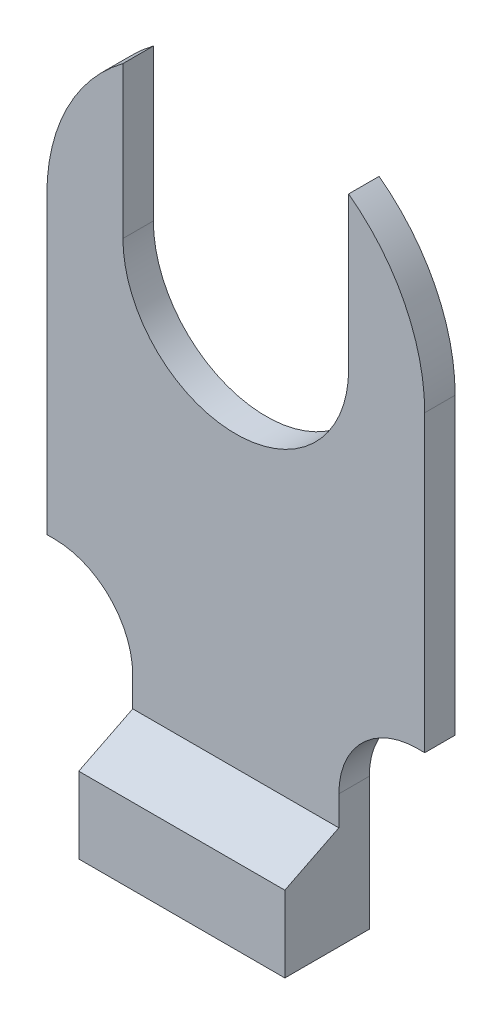
ISO-10303-21;
HEADER;
FILE_DESCRIPTION(('STEP AP214'),'2;1');
FILE_NAME('part.step','',(''),(''),'','','');
FILE_SCHEMA(('AUTOMOTIVE_DESIGN { 1 0 10303 214 1 1 1 1 }'));
ENDSEC;
DATA;
#1=APPLICATION_CONTEXT('core data for automotive mechanical design processes');
#2=APPLICATION_PROTOCOL_DEFINITION('international standard','automotive_design',2000,#1);
#3=PRODUCT_CONTEXT('',#1,'mechanical');
#4=PRODUCT('Part','Part','',(#3));
#5=PRODUCT_RELATED_PRODUCT_CATEGORY('part','',(#4));
#6=PRODUCT_DEFINITION_FORMATION('','',#4);
#7=PRODUCT_DEFINITION_CONTEXT('part definition',#1,'design');
#8=PRODUCT_DEFINITION('design','',#6,#7);
#9=PRODUCT_DEFINITION_SHAPE('','',#8);
#10=(LENGTH_UNIT() NAMED_UNIT(*) SI_UNIT(.MILLI.,.METRE.));
#11=(NAMED_UNIT(*) PLANE_ANGLE_UNIT() SI_UNIT($,.RADIAN.));
#12=(NAMED_UNIT(*) SI_UNIT($,.STERADIAN.) SOLID_ANGLE_UNIT());
#13=UNCERTAINTY_MEASURE_WITH_UNIT(LENGTH_MEASURE(1.E-05),#10,'distance_accuracy_value','');
#14=(GEOMETRIC_REPRESENTATION_CONTEXT(3) GLOBAL_UNCERTAINTY_ASSIGNED_CONTEXT((#13)) GLOBAL_UNIT_ASSIGNED_CONTEXT((#10,
#11,#12)) REPRESENTATION_CONTEXT('',''));
#15=CARTESIAN_POINT('',(0.,0.,0.));
#16=DIRECTION('',(0.,0.,1.));
#17=DIRECTION('',(1.,0.,0.));
#18=AXIS2_PLACEMENT_3D('',#15,#16,#17);
#19=CARTESIAN_POINT('',(0.,0.,1.24));
#20=DIRECTION('',(0.,0.,-1.));
#21=DIRECTION('',(-1.,0.,0.));
#22=AXIS2_PLACEMENT_3D('',#19,#20,#21);
#23=CYLINDRICAL_SURFACE('',#22,4.6);
#24=CARTESIAN_POINT('',(0.,0.,0.));
#25=DIRECTION('',(0.,0.,-1.));
#26=DIRECTION('',(1.,0.,0.));
#27=AXIS2_PLACEMENT_3D('',#24,#25,#26);
#28=CIRCLE('',#27,4.6);
#29=CARTESIAN_POINT('',(4.6,0.,0.));
#30=VERTEX_POINT('',#29);
#31=CARTESIAN_POINT('',(-4.6,0.,0.));
#32=VERTEX_POINT('',#31);
#33=EDGE_CURVE('E198',#30,#32,#28,.T.);
#34=ORIENTED_EDGE('',*,*,#33,.T.);
#35=DIRECTION('',(0.,0.,-1.));
#36=VECTOR('',#35,1.);
#37=CARTESIAN_POINT('',(-4.6,0.,1.24));
#38=LINE('',#37,#36);
#39=CARTESIAN_POINT('',(-4.6,0.,1.24));
#40=VERTEX_POINT('',#39);
#41=EDGE_CURVE('E258',#40,#32,#38,.T.);
#42=ORIENTED_EDGE('',*,*,#41,.F.);
#43=CARTESIAN_POINT('',(0.,0.,1.24));
#44=DIRECTION('',(0.,0.,-1.));
#45=DIRECTION('',(1.,0.,0.));
#46=AXIS2_PLACEMENT_3D('',#43,#44,#45);
#47=CIRCLE('',#46,4.6);
#48=CARTESIAN_POINT('',(4.6,0.,1.24));
#49=VERTEX_POINT('',#48);
#50=EDGE_CURVE('E210',#49,#40,#47,.T.);
#51=ORIENTED_EDGE('',*,*,#50,.F.);
#52=DIRECTION('',(0.,0.,-1.));
#53=VECTOR('',#52,1.);
#54=CARTESIAN_POINT('',(4.6,0.,1.24));
#55=LINE('',#54,#53);
#56=EDGE_CURVE('E227',#49,#30,#55,.T.);
#57=ORIENTED_EDGE('',*,*,#56,.T.);
#58=EDGE_LOOP('',(#34,#42,#51,#57));
#59=FACE_BOUND('',#58,.T.);
#60=ADVANCED_FACE('F35',(#59),#23,.F.);
#61=CARTESIAN_POINT('',(-4.6,0.,1.24));
#62=DIRECTION('',(-1.,0.,0.));
#63=DIRECTION('',(0.,0.,1.));
#64=AXIS2_PLACEMENT_3D('',#61,#62,#63);
#65=PLANE('',#64);
#66=DIRECTION('',(0.,1.,0.));
#67=VECTOR('',#66,1.);
#68=CARTESIAN_POINT('',(-4.6,0.,0.));
#69=LINE('',#68,#67);
#70=CARTESIAN_POINT('',(-4.6,6.17494939250517,0.));
#71=VERTEX_POINT('',#70);
#72=EDGE_CURVE('E230',#32,#71,#69,.T.);
#73=ORIENTED_EDGE('',*,*,#72,.T.);
#74=DIRECTION('',(0.,0.,-1.));
#75=VECTOR('',#74,1.);
#76=CARTESIAN_POINT('',(-4.6,6.17494939250517,1.24));
#77=LINE('',#76,#75);
#78=CARTESIAN_POINT('',(-4.6,6.17494939250517,1.24));
#79=VERTEX_POINT('',#78);
#80=EDGE_CURVE('E255',#79,#71,#77,.T.);
#81=ORIENTED_EDGE('',*,*,#80,.F.);
#82=DIRECTION('',(0.,1.,0.));
#83=VECTOR('',#82,1.);
#84=CARTESIAN_POINT('',(-4.6,0.,1.24));
#85=LINE('',#84,#83);
#86=EDGE_CURVE('E213',#40,#79,#85,.T.);
#87=ORIENTED_EDGE('',*,*,#86,.F.);
#88=ORIENTED_EDGE('',*,*,#41,.T.);
#89=EDGE_LOOP('',(#73,#81,#87,#88));
#90=FACE_BOUND('',#89,.T.);
#91=ADVANCED_FACE('F308',(#90),#65,.F.);
#92=CARTESIAN_POINT('',(0.,0.,1.24));
#93=DIRECTION('',(0.,0.,-1.));
#94=DIRECTION('',(-1.,0.,0.));
#95=AXIS2_PLACEMENT_3D('',#92,#93,#94);
#96=CYLINDRICAL_SURFACE('',#95,7.7);
#97=CARTESIAN_POINT('',(0.,0.,0.));
#98=DIRECTION('',(0.,0.,1.));
#99=DIRECTION('',(1.,0.,0.));
#100=AXIS2_PLACEMENT_3D('',#97,#98,#99);
#101=CIRCLE('',#100,7.7);
#102=CARTESIAN_POINT('',(-7.7,0.,0.));
#103=VERTEX_POINT('',#102);
#104=EDGE_CURVE('E232',#71,#103,#101,.T.);
#105=ORIENTED_EDGE('',*,*,#104,.T.);
#106=DIRECTION('',(0.,0.,-1.));
#107=VECTOR('',#106,1.);
#108=CARTESIAN_POINT('',(-7.7,0.,1.24));
#109=LINE('',#108,#107);
#110=CARTESIAN_POINT('',(-7.7,0.,1.24));
#111=VERTEX_POINT('',#110);
#112=EDGE_CURVE('E252',#111,#103,#109,.T.);
#113=ORIENTED_EDGE('',*,*,#112,.F.);
#114=CARTESIAN_POINT('',(0.,0.,1.24));
#115=DIRECTION('',(0.,0.,1.));
#116=DIRECTION('',(1.,0.,0.));
#117=AXIS2_PLACEMENT_3D('',#114,#115,#116);
#118=CIRCLE('',#117,7.7);
#119=EDGE_CURVE('E216',#79,#111,#118,.T.);
#120=ORIENTED_EDGE('',*,*,#119,.F.);
#121=ORIENTED_EDGE('',*,*,#80,.T.);
#122=EDGE_LOOP('',(#105,#113,#120,#121));
#123=FACE_BOUND('',#122,.T.);
#124=ADVANCED_FACE('F313',(#123),#96,.T.);
#125=CARTESIAN_POINT('',(-7.7,-20.6,1.24));
#126=DIRECTION('',(1.,0.,0.));
#127=DIRECTION('',(0.,1.,0.));
#128=AXIS2_PLACEMENT_3D('',#125,#126,#127);
#129=PLANE('',#128);
#130=DIRECTION('',(0.,-1.,0.));
#131=VECTOR('',#130,1.);
#132=CARTESIAN_POINT('',(-7.7,-20.6,0.));
#133=LINE('',#132,#131);
#134=CARTESIAN_POINT('',(-7.7,-12.,0.));
#135=VERTEX_POINT('',#134);
#136=EDGE_CURVE('E234',#103,#135,#133,.T.);
#137=ORIENTED_EDGE('',*,*,#136,.T.);
#138=DIRECTION('',(0.,0.,1.));
#139=VECTOR('',#138,1.);
#140=CARTESIAN_POINT('',(-7.7,-12.,-9.28493403315286));
#141=LINE('',#140,#139);
#142=CARTESIAN_POINT('',(-7.7,-12.,1.24));
#143=VERTEX_POINT('',#142);
#144=EDGE_CURVE('E193',#135,#143,#141,.T.);
#145=ORIENTED_EDGE('',*,*,#144,.T.);
#146=DIRECTION('',(0.,-1.,0.));
#147=VECTOR('',#146,1.);
#148=CARTESIAN_POINT('',(-7.7,-20.6,1.24));
#149=LINE('',#148,#147);
#150=EDGE_CURVE('E218',#111,#143,#149,.T.);
#151=ORIENTED_EDGE('',*,*,#150,.F.);
#152=ORIENTED_EDGE('',*,*,#112,.T.);
#153=EDGE_LOOP('',(#137,#145,#151,#152));
#154=FACE_BOUND('',#153,.T.);
#155=ADVANCED_FACE('F316',(#154),#129,.F.);
#156=CARTESIAN_POINT('',(7.7,-20.6,1.24));
#157=DIRECTION('',(0.,1.,0.));
#158=DIRECTION('',(0.,0.,1.));
#159=AXIS2_PLACEMENT_3D('',#156,#157,#158);
#160=PLANE('',#159);
#161=DIRECTION('',(1.,0.,0.));
#162=VECTOR('',#161,1.);
#163=CARTESIAN_POINT('',(7.7,-20.6,0.));
#164=LINE('',#163,#162);
#165=CARTESIAN_POINT('',(-4.2,-20.6,0.));
#166=VERTEX_POINT('',#165);
#167=CARTESIAN_POINT('',(4.2,-20.6,0.));
#168=VERTEX_POINT('',#167);
#169=EDGE_CURVE('E237',#166,#168,#164,.T.);
#170=ORIENTED_EDGE('',*,*,#169,.T.);
#171=DIRECTION('',(0.,0.,1.));
#172=VECTOR('',#171,1.);
#173=CARTESIAN_POINT('',(4.2,-20.6,-9.28493403315286));
#174=LINE('',#173,#172);
#175=CARTESIAN_POINT('',(4.2,-20.6,3.44));
#176=VERTEX_POINT('',#175);
#177=EDGE_CURVE('E159',#168,#176,#174,.T.);
#178=ORIENTED_EDGE('',*,*,#177,.T.);
#179=DIRECTION('',(1.,0.,0.));
#180=VECTOR('',#179,1.);
#181=CARTESIAN_POINT('',(-4.2,-20.6,3.44));
#182=LINE('',#181,#180);
#183=CARTESIAN_POINT('',(-4.2,-20.6,3.44));
#184=VERTEX_POINT('',#183);
#185=EDGE_CURVE('E157',#184,#176,#182,.T.);
#186=ORIENTED_EDGE('',*,*,#185,.F.);
#187=DIRECTION('',(0.,0.,1.));
#188=VECTOR('',#187,1.);
#189=CARTESIAN_POINT('',(-4.2,-20.6,-9.28493403315286));
#190=LINE('',#189,#188);
#191=EDGE_CURVE('E146',#166,#184,#190,.T.);
#192=ORIENTED_EDGE('',*,*,#191,.F.);
#193=EDGE_LOOP('',(#170,#178,#186,#192));
#194=FACE_BOUND('',#193,.T.);
#195=ADVANCED_FACE('F158',(#194),#160,.F.);
#196=CARTESIAN_POINT('',(7.7,-20.6,1.24));
#197=DIRECTION('',(-1.,0.,0.));
#198=DIRECTION('',(0.,-1.,0.));
#199=AXIS2_PLACEMENT_3D('',#196,#197,#198);
#200=PLANE('',#199);
#201=DIRECTION('',(0.,1.,0.));
#202=VECTOR('',#201,1.);
#203=CARTESIAN_POINT('',(7.7,-20.6,1.24));
#204=LINE('',#203,#202);
#205=CARTESIAN_POINT('',(7.7,-12.,1.24));
#206=VERTEX_POINT('',#205);
#207=CARTESIAN_POINT('',(7.7,0.,1.24));
#208=VERTEX_POINT('',#207);
#209=EDGE_CURVE('E221',#206,#208,#204,.T.);
#210=ORIENTED_EDGE('',*,*,#209,.F.);
#211=DIRECTION('',(0.,0.,1.));
#212=VECTOR('',#211,1.);
#213=CARTESIAN_POINT('',(7.7,-12.,-9.28493403315286));
#214=LINE('',#213,#212);
#215=CARTESIAN_POINT('',(7.7,-12.,0.));
#216=VERTEX_POINT('',#215);
#217=EDGE_CURVE('E185',#216,#206,#214,.T.);
#218=ORIENTED_EDGE('',*,*,#217,.F.);
#219=DIRECTION('',(0.,1.,0.));
#220=VECTOR('',#219,1.);
#221=CARTESIAN_POINT('',(7.7,-20.6,0.));
#222=LINE('',#221,#220);
#223=CARTESIAN_POINT('',(7.7,0.,0.));
#224=VERTEX_POINT('',#223);
#225=EDGE_CURVE('E239',#216,#224,#222,.T.);
#226=ORIENTED_EDGE('',*,*,#225,.T.);
#227=DIRECTION('',(0.,0.,-1.));
#228=VECTOR('',#227,1.);
#229=CARTESIAN_POINT('',(7.7,0.,1.24));
#230=LINE('',#229,#228);
#231=EDGE_CURVE('E249',#208,#224,#230,.T.);
#232=ORIENTED_EDGE('',*,*,#231,.F.);
#233=EDGE_LOOP('',(#210,#218,#226,#232));
#234=FACE_BOUND('',#233,.T.);
#235=ADVANCED_FACE('F288',(#234),#200,.F.);
#236=CARTESIAN_POINT('',(0.,0.,1.24));
#237=DIRECTION('',(0.,0.,-1.));
#238=DIRECTION('',(-1.,0.,0.));
#239=AXIS2_PLACEMENT_3D('',#236,#237,#238);
#240=CYLINDRICAL_SURFACE('',#239,7.7);
#241=CARTESIAN_POINT('',(0.,0.,0.));
#242=DIRECTION('',(0.,0.,1.));
#243=DIRECTION('',(1.,0.,0.));
#244=AXIS2_PLACEMENT_3D('',#241,#242,#243);
#245=CIRCLE('',#244,7.7);
#246=CARTESIAN_POINT('',(4.6,6.17494939250517,0.));
#247=VERTEX_POINT('',#246);
#248=EDGE_CURVE('E241',#224,#247,#245,.T.);
#249=ORIENTED_EDGE('',*,*,#248,.T.);
#250=DIRECTION('',(0.,0.,-1.));
#251=VECTOR('',#250,1.);
#252=CARTESIAN_POINT('',(4.6,6.17494939250517,1.24));
#253=LINE('',#252,#251);
#254=CARTESIAN_POINT('',(4.6,6.17494939250517,1.24));
#255=VERTEX_POINT('',#254);
#256=EDGE_CURVE('E246',#255,#247,#253,.T.);
#257=ORIENTED_EDGE('',*,*,#256,.F.);
#258=CARTESIAN_POINT('',(0.,0.,1.24));
#259=DIRECTION('',(0.,0.,1.));
#260=DIRECTION('',(1.,0.,0.));
#261=AXIS2_PLACEMENT_3D('',#258,#259,#260);
#262=CIRCLE('',#261,7.7);
#263=EDGE_CURVE('E223',#208,#255,#262,.T.);
#264=ORIENTED_EDGE('',*,*,#263,.F.);
#265=ORIENTED_EDGE('',*,*,#231,.T.);
#266=EDGE_LOOP('',(#249,#257,#264,#265));
#267=FACE_BOUND('',#266,.T.);
#268=ADVANCED_FACE('F297',(#267),#240,.T.);
#269=CARTESIAN_POINT('',(4.6,0.,1.24));
#270=DIRECTION('',(1.,0.,0.));
#271=DIRECTION('',(0.,0.,-1.));
#272=AXIS2_PLACEMENT_3D('',#269,#270,#271);
#273=PLANE('',#272);
#274=DIRECTION('',(0.,-1.,0.));
#275=VECTOR('',#274,1.);
#276=CARTESIAN_POINT('',(4.6,0.,0.));
#277=LINE('',#276,#275);
#278=EDGE_CURVE('E214',#247,#30,#277,.T.);
#279=ORIENTED_EDGE('',*,*,#278,.T.);
#280=ORIENTED_EDGE('',*,*,#56,.F.);
#281=DIRECTION('',(0.,-1.,0.));
#282=VECTOR('',#281,1.);
#283=CARTESIAN_POINT('',(4.6,0.,1.24));
#284=LINE('',#283,#282);
#285=EDGE_CURVE('E225',#255,#49,#284,.T.);
#286=ORIENTED_EDGE('',*,*,#285,.F.);
#287=ORIENTED_EDGE('',*,*,#256,.T.);
#288=EDGE_LOOP('',(#279,#280,#286,#287));
#289=FACE_BOUND('',#288,.T.);
#290=ADVANCED_FACE('F301',(#289),#273,.F.);
#291=CARTESIAN_POINT('',(0.,0.,1.24));
#292=DIRECTION('',(0.,0.,1.));
#293=DIRECTION('',(1.,0.,0.));
#294=AXIS2_PLACEMENT_3D('',#291,#292,#293);
#295=PLANE('',#294);
#296=DIRECTION('',(0.,1.,0.));
#297=VECTOR('',#296,1.);
#298=CARTESIAN_POINT('',(-4.2,-20.6,1.24));
#299=LINE('',#298,#297);
#300=CARTESIAN_POINT('',(-4.2,-16.4,1.24));
#301=VERTEX_POINT('',#300);
#302=CARTESIAN_POINT('',(-4.2,-15.2,1.24));
#303=VERTEX_POINT('',#302);
#304=EDGE_CURVE('E190',#301,#303,#299,.T.);
#305=ORIENTED_EDGE('',*,*,#304,.F.);
#306=DIRECTION('',(1.,0.,0.));
#307=VECTOR('',#306,1.);
#308=CARTESIAN_POINT('',(0.,-16.4,1.24));
#309=LINE('',#308,#307);
#310=CARTESIAN_POINT('',(4.2,-16.4,1.24));
#311=VERTEX_POINT('',#310);
#312=EDGE_CURVE('E261',#301,#311,#309,.T.);
#313=ORIENTED_EDGE('',*,*,#312,.T.);
#314=DIRECTION('',(0.,-1.,0.));
#315=VECTOR('',#314,1.);
#316=CARTESIAN_POINT('',(4.2,-20.6,1.24));
#317=LINE('',#316,#315);
#318=CARTESIAN_POINT('',(4.2,-15.2,1.24));
#319=VERTEX_POINT('',#318);
#320=EDGE_CURVE('E177',#319,#311,#317,.T.);
#321=ORIENTED_EDGE('',*,*,#320,.F.);
#322=CARTESIAN_POINT('',(7.4,-15.2,1.24));
#323=DIRECTION('',(0.,0.,1.));
#324=DIRECTION('',(-1.,0.,0.));
#325=AXIS2_PLACEMENT_3D('',#322,#323,#324);
#326=CIRCLE('',#325,3.2);
#327=CARTESIAN_POINT('',(7.4,-12.,1.24));
#328=VERTEX_POINT('',#327);
#329=EDGE_CURVE('E168',#328,#319,#326,.T.);
#330=ORIENTED_EDGE('',*,*,#329,.F.);
#331=DIRECTION('',(-1.,0.,0.));
#332=VECTOR('',#331,1.);
#333=CARTESIAN_POINT('',(7.7,-12.,1.24));
#334=LINE('',#333,#332);
#335=EDGE_CURVE('E180',#206,#328,#334,.T.);
#336=ORIENTED_EDGE('',*,*,#335,.F.);
#337=ORIENTED_EDGE('',*,*,#209,.T.);
#338=ORIENTED_EDGE('',*,*,#263,.T.);
#339=ORIENTED_EDGE('',*,*,#285,.T.);
#340=ORIENTED_EDGE('',*,*,#50,.T.);
#341=ORIENTED_EDGE('',*,*,#86,.T.);
#342=ORIENTED_EDGE('',*,*,#119,.T.);
#343=ORIENTED_EDGE('',*,*,#150,.T.);
#344=DIRECTION('',(-1.,0.,0.));
#345=VECTOR('',#344,1.);
#346=CARTESIAN_POINT('',(-7.7,-12.,1.24));
#347=LINE('',#346,#345);
#348=CARTESIAN_POINT('',(-7.4,-12.,1.24));
#349=VERTEX_POINT('',#348);
#350=EDGE_CURVE('E155',#349,#143,#347,.T.);
#351=ORIENTED_EDGE('',*,*,#350,.F.);
#352=CARTESIAN_POINT('',(-7.4,-15.2,1.24));
#353=DIRECTION('',(0.,0.,1.));
#354=DIRECTION('',(1.,0.,0.));
#355=AXIS2_PLACEMENT_3D('',#352,#353,#354);
#356=CIRCLE('',#355,3.2);
#357=EDGE_CURVE('E200',#303,#349,#356,.T.);
#358=ORIENTED_EDGE('',*,*,#357,.F.);
#359=EDGE_LOOP('',(#305,#313,#321,#330,#336,#337,#338,#339,#340,#341,#342,#343,#351,#358));
#360=FACE_BOUND('',#359,.T.);
#361=ADVANCED_FACE('F269',(#360),#295,.T.);
#362=CARTESIAN_POINT('',(0.,0.,0.));
#363=DIRECTION('',(0.,0.,1.));
#364=DIRECTION('',(1.,0.,0.));
#365=AXIS2_PLACEMENT_3D('',#362,#363,#364);
#366=PLANE('',#365);
#367=ORIENTED_EDGE('',*,*,#225,.F.);
#368=DIRECTION('',(1.,0.,0.));
#369=VECTOR('',#368,1.);
#370=CARTESIAN_POINT('',(7.7,-12.,0.));
#371=LINE('',#370,#369);
#372=CARTESIAN_POINT('',(7.4,-12.,0.));
#373=VERTEX_POINT('',#372);
#374=EDGE_CURVE('E169',#373,#216,#371,.T.);
#375=ORIENTED_EDGE('',*,*,#374,.F.);
#376=CARTESIAN_POINT('',(7.4,-15.2,0.));
#377=DIRECTION('',(0.,0.,1.));
#378=DIRECTION('',(1.,0.,0.));
#379=AXIS2_PLACEMENT_3D('',#376,#377,#378);
#380=CIRCLE('',#379,3.2);
#381=CARTESIAN_POINT('',(4.2,-15.2,0.));
#382=VERTEX_POINT('',#381);
#383=EDGE_CURVE('E171',#382,#373,#380,.F.);
#384=ORIENTED_EDGE('',*,*,#383,.F.);
#385=DIRECTION('',(0.,1.,0.));
#386=VECTOR('',#385,1.);
#387=CARTESIAN_POINT('',(4.2,-20.6,0.));
#388=LINE('',#387,#386);
#389=EDGE_CURVE('E174',#168,#382,#388,.T.);
#390=ORIENTED_EDGE('',*,*,#389,.F.);
#391=ORIENTED_EDGE('',*,*,#169,.F.);
#392=DIRECTION('',(0.,-1.,0.));
#393=VECTOR('',#392,1.);
#394=CARTESIAN_POINT('',(-4.2,-20.6,0.));
#395=LINE('',#394,#393);
#396=CARTESIAN_POINT('',(-4.2,-15.2,0.));
#397=VERTEX_POINT('',#396);
#398=EDGE_CURVE('E150',#397,#166,#395,.T.);
#399=ORIENTED_EDGE('',*,*,#398,.F.);
#400=CARTESIAN_POINT('',(-7.4,-15.2,0.));
#401=DIRECTION('',(0.,0.,1.));
#402=DIRECTION('',(1.,0.,0.));
#403=AXIS2_PLACEMENT_3D('',#400,#401,#402);
#404=CIRCLE('',#403,3.2);
#405=CARTESIAN_POINT('',(-7.4,-12.,0.));
#406=VERTEX_POINT('',#405);
#407=EDGE_CURVE('E192',#406,#397,#404,.F.);
#408=ORIENTED_EDGE('',*,*,#407,.F.);
#409=DIRECTION('',(1.,0.,0.));
#410=VECTOR('',#409,1.);
#411=CARTESIAN_POINT('',(-7.7,-12.,0.));
#412=LINE('',#411,#410);
#413=EDGE_CURVE('E196',#135,#406,#412,.T.);
#414=ORIENTED_EDGE('',*,*,#413,.F.);
#415=ORIENTED_EDGE('',*,*,#136,.F.);
#416=ORIENTED_EDGE('',*,*,#104,.F.);
#417=ORIENTED_EDGE('',*,*,#72,.F.);
#418=ORIENTED_EDGE('',*,*,#33,.F.);
#419=ORIENTED_EDGE('',*,*,#278,.F.);
#420=ORIENTED_EDGE('',*,*,#248,.F.);
#421=EDGE_LOOP('',(#367,#375,#384,#390,#391,#399,#408,#414,#415,#416,#417,#418,#419,#420));
#422=FACE_BOUND('',#421,.T.);
#423=ADVANCED_FACE('F292',(#422),#366,.F.);
#424=CARTESIAN_POINT('',(-7.7,-12.,-9.28493403315286));
#425=DIRECTION('',(0.,1.,0.));
#426=DIRECTION('',(-1.,0.,0.));
#427=AXIS2_PLACEMENT_3D('',#424,#425,#426);
#428=PLANE('',#427);
#429=ORIENTED_EDGE('',*,*,#413,.T.);
#430=DIRECTION('',(0.,0.,1.));
#431=VECTOR('',#430,1.);
#432=CARTESIAN_POINT('',(-7.4,-12.,-9.28493403315286));
#433=LINE('',#432,#431);
#434=EDGE_CURVE('E206',#406,#349,#433,.T.);
#435=ORIENTED_EDGE('',*,*,#434,.T.);
#436=ORIENTED_EDGE('',*,*,#350,.T.);
#437=ORIENTED_EDGE('',*,*,#144,.F.);
#438=EDGE_LOOP('',(#429,#435,#436,#437));
#439=FACE_BOUND('',#438,.T.);
#440=ADVANCED_FACE('F320',(#439),#428,.F.);
#441=CARTESIAN_POINT('',(-7.4,-15.2,-9.28493403315286));
#442=DIRECTION('',(0.,0.,1.));
#443=DIRECTION('',(1.,0.,0.));
#444=AXIS2_PLACEMENT_3D('',#441,#442,#443);
#445=CYLINDRICAL_SURFACE('',#444,3.2);
#446=ORIENTED_EDGE('',*,*,#407,.T.);
#447=DIRECTION('',(0.,0.,1.));
#448=VECTOR('',#447,1.);
#449=CARTESIAN_POINT('',(-4.2,-15.2,-9.28493403315286));
#450=LINE('',#449,#448);
#451=EDGE_CURVE('E154',#397,#303,#450,.T.);
#452=ORIENTED_EDGE('',*,*,#451,.T.);
#453=ORIENTED_EDGE('',*,*,#357,.T.);
#454=ORIENTED_EDGE('',*,*,#434,.F.);
#455=EDGE_LOOP('',(#446,#452,#453,#454));
#456=FACE_BOUND('',#455,.T.);
#457=ADVANCED_FACE('F324',(#456),#445,.F.);
#458=CARTESIAN_POINT('',(-4.2,-20.6,-9.28493403315286));
#459=DIRECTION('',(1.,0.,0.));
#460=DIRECTION('',(0.,0.,-1.));
#461=AXIS2_PLACEMENT_3D('',#458,#459,#460);
#462=PLANE('',#461);
#463=ORIENTED_EDGE('',*,*,#398,.T.);
#464=ORIENTED_EDGE('',*,*,#191,.T.);
#465=DIRECTION('',(0.,-1.,0.));
#466=VECTOR('',#465,1.);
#467=CARTESIAN_POINT('',(-4.2,-20.6,3.44));
#468=LINE('',#467,#466);
#469=CARTESIAN_POINT('',(-4.2,-17.5,3.44));
#470=VERTEX_POINT('',#469);
#471=EDGE_CURVE('E57',#470,#184,#468,.T.);
#472=ORIENTED_EDGE('',*,*,#471,.F.);
#473=DIRECTION('',(0.,0.447213595499958,-0.894427190999916));
#474=VECTOR('',#473,1.);
#475=CARTESIAN_POINT('',(-4.2,-13.0300263867389,-5.49994722652229));
#476=LINE('',#475,#474);
#477=EDGE_CURVE('E43',#470,#301,#476,.T.);
#478=ORIENTED_EDGE('',*,*,#477,.T.);
#479=ORIENTED_EDGE('',*,*,#304,.T.);
#480=ORIENTED_EDGE('',*,*,#451,.F.);
#481=EDGE_LOOP('',(#463,#464,#472,#478,#479,#480));
#482=FACE_BOUND('',#481,.T.);
#483=ADVANCED_FACE('F148',(#482),#462,.F.);
#484=CARTESIAN_POINT('',(7.4,-15.2,-9.28493403315286));
#485=DIRECTION('',(0.,0.,1.));
#486=DIRECTION('',(1.,0.,0.));
#487=AXIS2_PLACEMENT_3D('',#484,#485,#486);
#488=CYLINDRICAL_SURFACE('',#487,3.2);
#489=ORIENTED_EDGE('',*,*,#383,.T.);
#490=DIRECTION('',(0.,0.,1.));
#491=VECTOR('',#490,1.);
#492=CARTESIAN_POINT('',(7.4,-12.,-9.28493403315286));
#493=LINE('',#492,#491);
#494=EDGE_CURVE('E172',#373,#328,#493,.T.);
#495=ORIENTED_EDGE('',*,*,#494,.T.);
#496=ORIENTED_EDGE('',*,*,#329,.T.);
#497=DIRECTION('',(0.,0.,1.));
#498=VECTOR('',#497,1.);
#499=CARTESIAN_POINT('',(4.2,-15.2,-9.28493403315286));
#500=LINE('',#499,#498);
#501=EDGE_CURVE('E183',#382,#319,#500,.T.);
#502=ORIENTED_EDGE('',*,*,#501,.F.);
#503=EDGE_LOOP('',(#489,#495,#496,#502));
#504=FACE_BOUND('',#503,.T.);
#505=ADVANCED_FACE('F279',(#504),#488,.F.);
#506=CARTESIAN_POINT('',(7.7,-12.,-9.28493403315286));
#507=DIRECTION('',(0.,1.,0.));
#508=DIRECTION('',(-1.,0.,0.));
#509=AXIS2_PLACEMENT_3D('',#506,#507,#508);
#510=PLANE('',#509);
#511=ORIENTED_EDGE('',*,*,#374,.T.);
#512=ORIENTED_EDGE('',*,*,#217,.T.);
#513=ORIENTED_EDGE('',*,*,#335,.T.);
#514=ORIENTED_EDGE('',*,*,#494,.F.);
#515=EDGE_LOOP('',(#511,#512,#513,#514));
#516=FACE_BOUND('',#515,.T.);
#517=ADVANCED_FACE('F284',(#516),#510,.F.);
#518=CARTESIAN_POINT('',(4.2,-20.6,-9.28493403315286));
#519=DIRECTION('',(-1.,0.,0.));
#520=DIRECTION('',(0.,0.,1.));
#521=AXIS2_PLACEMENT_3D('',#518,#519,#520);
#522=PLANE('',#521);
#523=ORIENTED_EDGE('',*,*,#389,.T.);
#524=ORIENTED_EDGE('',*,*,#501,.T.);
#525=ORIENTED_EDGE('',*,*,#320,.T.);
#526=DIRECTION('',(0.,-0.447213595499958,0.894427190999916));
#527=VECTOR('',#526,1.);
#528=CARTESIAN_POINT('',(4.2,-13.0300263867389,-5.49994722652229));
#529=LINE('',#528,#527);
#530=CARTESIAN_POINT('',(4.2,-17.5,3.44));
#531=VERTEX_POINT('',#530);
#532=EDGE_CURVE('E11',#311,#531,#529,.T.);
#533=ORIENTED_EDGE('',*,*,#532,.T.);
#534=DIRECTION('',(0.,1.,0.));
#535=VECTOR('',#534,1.);
#536=CARTESIAN_POINT('',(4.2,-20.6,3.44));
#537=LINE('',#536,#535);
#538=EDGE_CURVE('E50',#176,#531,#537,.T.);
#539=ORIENTED_EDGE('',*,*,#538,.F.);
#540=ORIENTED_EDGE('',*,*,#177,.F.);
#541=EDGE_LOOP('',(#523,#524,#525,#533,#539,#540));
#542=FACE_BOUND('',#541,.T.);
#543=ADVANCED_FACE('F273',(#542),#522,.F.);
#544=CARTESIAN_POINT('',(0.,0.,3.44));
#545=DIRECTION('',(0.,0.,-1.));
#546=DIRECTION('',(-1.,0.,0.));
#547=AXIS2_PLACEMENT_3D('',#544,#545,#546);
#548=PLANE('',#547);
#549=ORIENTED_EDGE('',*,*,#471,.T.);
#550=ORIENTED_EDGE('',*,*,#185,.T.);
#551=ORIENTED_EDGE('',*,*,#538,.T.);
#552=DIRECTION('',(-1.,0.,0.));
#553=VECTOR('',#552,1.);
#554=CARTESIAN_POINT('',(0.,-17.5,3.44));
#555=LINE('',#554,#553);
#556=EDGE_CURVE('E163',#531,#470,#555,.T.);
#557=ORIENTED_EDGE('',*,*,#556,.T.);
#558=EDGE_LOOP('',(#549,#550,#551,#557));
#559=FACE_BOUND('',#558,.T.);
#560=ADVANCED_FACE('F161',(#559),#548,.F.);
#561=CARTESIAN_POINT('',(-4.2,-17.6,3.64));
#562=DIRECTION('',(0.,-0.894427190999916,-0.447213595499958));
#563=DIRECTION('',(-1.,0.,0.));
#564=AXIS2_PLACEMENT_3D('',#561,#562,#563);
#565=PLANE('',#564);
#566=ORIENTED_EDGE('',*,*,#532,.F.);
#567=ORIENTED_EDGE('',*,*,#312,.F.);
#568=ORIENTED_EDGE('',*,*,#477,.F.);
#569=ORIENTED_EDGE('',*,*,#556,.F.);
#570=EDGE_LOOP('',(#566,#567,#568,#569));
#571=FACE_BOUND('',#570,.T.);
#572=ADVANCED_FACE('F37',(#571),#565,.F.);
#573=CLOSED_SHELL('',(#60,#91,#124,#155,#195,#235,#268,#290,#361,#423,#440,#457,#483,#505,#517,
#543,#560,#572));
#574=MANIFOLD_SOLID_BREP('B2',#573);
#575=ADVANCED_BREP_SHAPE_REPRESENTATION('',(#18,#574),#14);
#576=SHAPE_DEFINITION_REPRESENTATION(#9,#575);
ENDSEC;
END-ISO-10303-21;
